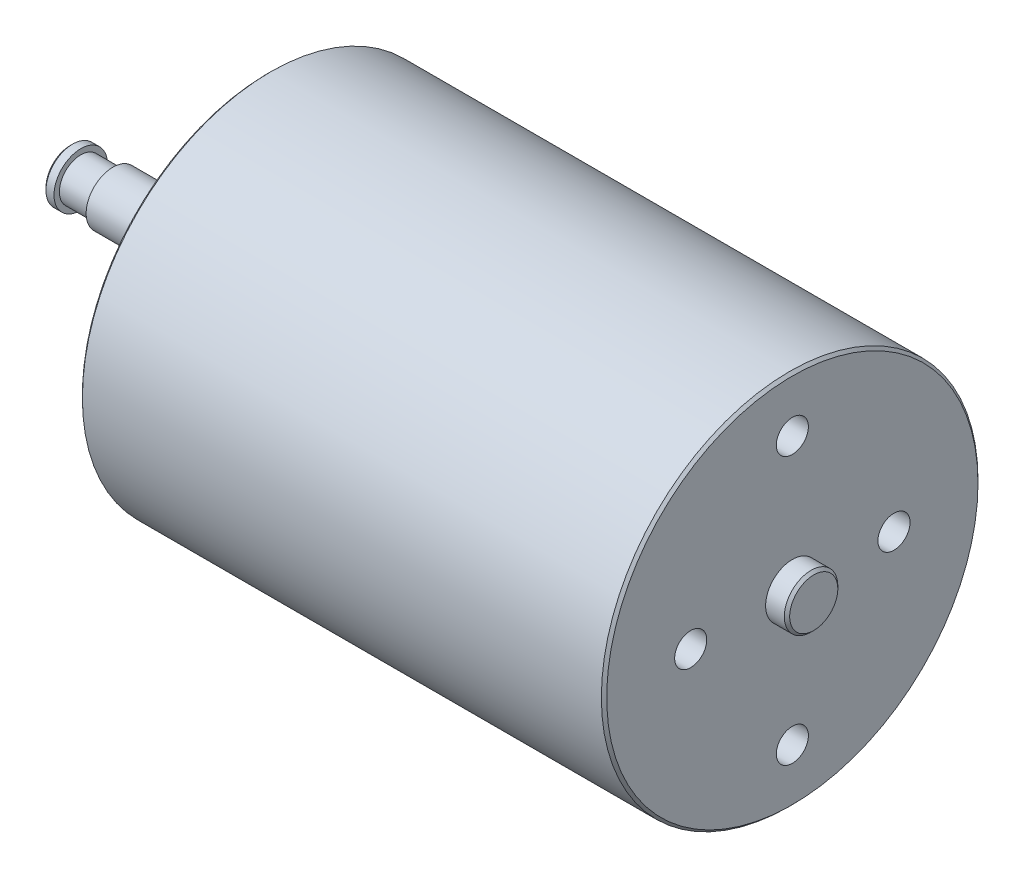
ISO-10303-21;
HEADER;
FILE_DESCRIPTION(('STEP AP214'),'2;1');
FILE_NAME('part.step','',(''),(''),'','','');
FILE_SCHEMA(('AUTOMOTIVE_DESIGN { 1 0 10303 214 1 1 1 1 }'));
ENDSEC;
DATA;
#1=APPLICATION_CONTEXT('core data for automotive mechanical design processes');
#2=APPLICATION_PROTOCOL_DEFINITION('international standard','automotive_design',2000,#1);
#3=PRODUCT_CONTEXT('',#1,'mechanical');
#4=PRODUCT('Part','Part','',(#3));
#5=PRODUCT_RELATED_PRODUCT_CATEGORY('part','',(#4));
#6=PRODUCT_DEFINITION_FORMATION('','',#4);
#7=PRODUCT_DEFINITION_CONTEXT('part definition',#1,'design');
#8=PRODUCT_DEFINITION('design','',#6,#7);
#9=PRODUCT_DEFINITION_SHAPE('','',#8);
#10=(LENGTH_UNIT() NAMED_UNIT(*) SI_UNIT(.MILLI.,.METRE.));
#11=(NAMED_UNIT(*) PLANE_ANGLE_UNIT() SI_UNIT($,.RADIAN.));
#12=(NAMED_UNIT(*) SI_UNIT($,.STERADIAN.) SOLID_ANGLE_UNIT());
#13=UNCERTAINTY_MEASURE_WITH_UNIT(LENGTH_MEASURE(1.E-05),#10,'distance_accuracy_value','');
#14=(GEOMETRIC_REPRESENTATION_CONTEXT(3) GLOBAL_UNCERTAINTY_ASSIGNED_CONTEXT((#13)) GLOBAL_UNIT_ASSIGNED_CONTEXT((#10,
#11,#12)) REPRESENTATION_CONTEXT('',''));
#15=CARTESIAN_POINT('',(0.,0.,0.));
#16=DIRECTION('',(0.,0.,1.));
#17=DIRECTION('',(1.,0.,0.));
#18=AXIS2_PLACEMENT_3D('',#15,#16,#17);
#19=CARTESIAN_POINT('',(49.,0.,0.));
#20=DIRECTION('',(-1.,0.,0.));
#21=DIRECTION('',(0.,0.,1.));
#22=AXIS2_PLACEMENT_3D('',#19,#20,#21);
#23=CYLINDRICAL_SURFACE('',#22,17.6);
#24=CARTESIAN_POINT('',(48.75,0.,0.));
#25=DIRECTION('',(1.,0.,0.));
#26=DIRECTION('',(0.,0.,-1.));
#27=AXIS2_PLACEMENT_3D('',#24,#25,#26);
#28=CIRCLE('',#27,17.6);
#29=CARTESIAN_POINT('',(48.75,0.,-17.6));
#30=VERTEX_POINT('',#29);
#31=EDGE_CURVE('E124',#30,#30,#28,.F.);
#32=ORIENTED_EDGE('',*,*,#31,.T.);
#33=EDGE_LOOP('',(#32));
#34=FACE_BOUND('',#33,.T.);
#35=CARTESIAN_POINT('',(0.250000000000007,0.,0.));
#36=DIRECTION('',(1.,0.,0.));
#37=DIRECTION('',(0.,0.,-1.));
#38=AXIS2_PLACEMENT_3D('',#35,#36,#37);
#39=CIRCLE('',#38,17.6);
#40=CARTESIAN_POINT('',(0.250000000000007,0.,-17.6));
#41=VERTEX_POINT('',#40);
#42=EDGE_CURVE('E128',#41,#41,#39,.T.);
#43=ORIENTED_EDGE('',*,*,#42,.T.);
#44=EDGE_LOOP('',(#43));
#45=FACE_BOUND('',#44,.T.);
#46=ADVANCED_FACE('F44',(#34,#45),#23,.T.);
#47=CARTESIAN_POINT('',(49.,0.,0.));
#48=DIRECTION('',(1.,0.,0.));
#49=DIRECTION('',(0.,0.,-1.));
#50=AXIS2_PLACEMENT_3D('',#47,#48,#49);
#51=PLANE('',#50);
#52=CARTESIAN_POINT('',(49.,0.,0.));
#53=DIRECTION('',(1.,0.,0.));
#54=DIRECTION('',(0.,0.,-1.));
#55=AXIS2_PLACEMENT_3D('',#52,#53,#54);
#56=CIRCLE('',#55,17.35);
#57=CARTESIAN_POINT('',(49.,0.,-17.35));
#58=VERTEX_POINT('',#57);
#59=EDGE_CURVE('E132',#58,#58,#56,.T.);
#60=ORIENTED_EDGE('',*,*,#59,.T.);
#61=EDGE_LOOP('',(#60));
#62=FACE_BOUND('',#61,.T.);
#63=CARTESIAN_POINT('',(49.,0.,0.));
#64=DIRECTION('',(1.,0.,0.));
#65=DIRECTION('',(0.,0.,-1.));
#66=AXIS2_PLACEMENT_3D('',#63,#64,#65);
#67=CIRCLE('',#66,2.5);
#68=CARTESIAN_POINT('',(49.,0.,-2.5));
#69=VERTEX_POINT('',#68);
#70=EDGE_CURVE('E173',#69,#69,#67,.T.);
#71=ORIENTED_EDGE('',*,*,#70,.F.);
#72=EDGE_LOOP('',(#71));
#73=FACE_BOUND('',#72,.T.);
#74=CARTESIAN_POINT('',(49.,12.5,0.));
#75=DIRECTION('',(1.,0.,0.));
#76=DIRECTION('',(0.,0.,-1.));
#77=AXIS2_PLACEMENT_3D('',#74,#75,#76);
#78=CIRCLE('',#77,1.49999999999999);
#79=CARTESIAN_POINT('',(49.,12.5,-1.49999999999999));
#80=VERTEX_POINT('',#79);
#81=EDGE_CURVE('E169',#80,#80,#78,.T.);
#82=ORIENTED_EDGE('',*,*,#81,.F.);
#83=EDGE_LOOP('',(#82));
#84=FACE_BOUND('',#83,.T.);
#85=CARTESIAN_POINT('',(49.,0.,-9.5));
#86=DIRECTION('',(1.,0.,0.));
#87=DIRECTION('',(0.,0.,-1.));
#88=AXIS2_PLACEMENT_3D('',#85,#86,#87);
#89=CIRCLE('',#88,1.49999999999999);
#90=CARTESIAN_POINT('',(49.,0.,-11.));
#91=VERTEX_POINT('',#90);
#92=EDGE_CURVE('E161',#91,#91,#89,.T.);
#93=ORIENTED_EDGE('',*,*,#92,.F.);
#94=EDGE_LOOP('',(#93));
#95=FACE_BOUND('',#94,.T.);
#96=CARTESIAN_POINT('',(49.,-12.5,0.));
#97=DIRECTION('',(1.,0.,0.));
#98=DIRECTION('',(0.,0.,-1.));
#99=AXIS2_PLACEMENT_3D('',#96,#97,#98);
#100=CIRCLE('',#99,1.49999999999999);
#101=CARTESIAN_POINT('',(49.,-12.5,-1.49999999999999));
#102=VERTEX_POINT('',#101);
#103=EDGE_CURVE('E153',#102,#102,#100,.T.);
#104=ORIENTED_EDGE('',*,*,#103,.F.);
#105=EDGE_LOOP('',(#104));
#106=FACE_BOUND('',#105,.T.);
#107=CARTESIAN_POINT('',(49.,0.,9.5));
#108=DIRECTION('',(1.,0.,0.));
#109=DIRECTION('',(0.,0.,-1.));
#110=AXIS2_PLACEMENT_3D('',#107,#108,#109);
#111=CIRCLE('',#110,1.49999999999999);
#112=CARTESIAN_POINT('',(49.,0.,8.00000000000001));
#113=VERTEX_POINT('',#112);
#114=EDGE_CURVE('E145',#113,#113,#111,.T.);
#115=ORIENTED_EDGE('',*,*,#114,.F.);
#116=EDGE_LOOP('',(#115));
#117=FACE_BOUND('',#116,.T.);
#118=ADVANCED_FACE('F206',(#62,#73,#84,#95,#106,#117),#51,.T.);
#119=CARTESIAN_POINT('',(0.,0.,0.));
#120=DIRECTION('',(1.,0.,0.));
#121=DIRECTION('',(0.,0.,-1.));
#122=AXIS2_PLACEMENT_3D('',#119,#120,#121);
#123=PLANE('',#122);
#124=CARTESIAN_POINT('',(0.,0.,0.));
#125=DIRECTION('',(1.,0.,0.));
#126=DIRECTION('',(0.,0.,-1.));
#127=AXIS2_PLACEMENT_3D('',#124,#125,#126);
#128=CIRCLE('',#127,17.35);
#129=CARTESIAN_POINT('',(0.,0.,-17.35));
#130=VERTEX_POINT('',#129);
#131=EDGE_CURVE('E120',#130,#130,#128,.F.);
#132=ORIENTED_EDGE('',*,*,#131,.T.);
#133=EDGE_LOOP('',(#132));
#134=FACE_BOUND('',#133,.T.);
#135=CARTESIAN_POINT('',(0.,0.,0.));
#136=DIRECTION('',(1.,0.,0.));
#137=DIRECTION('',(0.,0.,-1.));
#138=AXIS2_PLACEMENT_3D('',#135,#136,#137);
#139=CIRCLE('',#138,2.5);
#140=CARTESIAN_POINT('',(0.,0.,-2.5));
#141=VERTEX_POINT('',#140);
#142=EDGE_CURVE('E137',#141,#141,#139,.F.);
#143=ORIENTED_EDGE('',*,*,#142,.F.);
#144=EDGE_LOOP('',(#143));
#145=FACE_BOUND('',#144,.T.);
#146=ADVANCED_FACE('F212',(#134,#145),#123,.F.);
#147=CARTESIAN_POINT('',(44.,0.,9.5));
#148=DIRECTION('',(1.,0.,0.));
#149=DIRECTION('',(0.,0.,-1.));
#150=AXIS2_PLACEMENT_3D('',#147,#148,#149);
#151=CONICAL_SURFACE('',#150,1.49999999999999,1.02974425867665);
#152=CARTESIAN_POINT('',(43.0987090714587,0.,9.5));
#153=VERTEX_POINT('',#152);
#154=VERTEX_LOOP('',#153);
#155=FACE_BOUND('',#154,.T.);
#156=CARTESIAN_POINT('',(44.,0.,9.5));
#157=DIRECTION('',(1.,0.,0.));
#158=DIRECTION('',(0.,0.,-1.));
#159=AXIS2_PLACEMENT_3D('',#156,#157,#158);
#160=CIRCLE('',#159,1.49999999999999);
#161=CARTESIAN_POINT('',(44.,0.,8.00000000000001));
#162=VERTEX_POINT('',#161);
#163=EDGE_CURVE('E141',#162,#162,#160,.T.);
#164=ORIENTED_EDGE('',*,*,#163,.T.);
#165=EDGE_LOOP('',(#164));
#166=FACE_BOUND('',#165,.T.);
#167=ADVANCED_FACE('F300',(#155,#166),#151,.F.);
#168=CARTESIAN_POINT('',(49.,0.,9.5));
#169=DIRECTION('',(1.,0.,0.));
#170=DIRECTION('',(0.,0.,-1.));
#171=AXIS2_PLACEMENT_3D('',#168,#169,#170);
#172=CYLINDRICAL_SURFACE('',#171,1.49999999999999);
#173=ORIENTED_EDGE('',*,*,#163,.F.);
#174=EDGE_LOOP('',(#173));
#175=FACE_BOUND('',#174,.T.);
#176=ORIENTED_EDGE('',*,*,#114,.T.);
#177=EDGE_LOOP('',(#176));
#178=FACE_BOUND('',#177,.T.);
#179=ADVANCED_FACE('F296',(#175,#178),#172,.F.);
#180=CARTESIAN_POINT('',(44.,-12.5,0.));
#181=DIRECTION('',(1.,0.,0.));
#182=DIRECTION('',(0.,0.,-1.));
#183=AXIS2_PLACEMENT_3D('',#180,#181,#182);
#184=CONICAL_SURFACE('',#183,1.49999999999999,1.02974425867665);
#185=CARTESIAN_POINT('',(43.0987090714587,-12.5,0.));
#186=VERTEX_POINT('',#185);
#187=VERTEX_LOOP('',#186);
#188=FACE_BOUND('',#187,.T.);
#189=CARTESIAN_POINT('',(44.,-12.5,0.));
#190=DIRECTION('',(1.,0.,0.));
#191=DIRECTION('',(0.,0.,-1.));
#192=AXIS2_PLACEMENT_3D('',#189,#190,#191);
#193=CIRCLE('',#192,1.49999999999999);
#194=CARTESIAN_POINT('',(44.,-12.5,-1.5));
#195=VERTEX_POINT('',#194);
#196=EDGE_CURVE('E149',#195,#195,#193,.T.);
#197=ORIENTED_EDGE('',*,*,#196,.T.);
#198=EDGE_LOOP('',(#197));
#199=FACE_BOUND('',#198,.T.);
#200=ADVANCED_FACE('F292',(#188,#199),#184,.F.);
#201=CARTESIAN_POINT('',(49.,-12.5,0.));
#202=DIRECTION('',(1.,0.,0.));
#203=DIRECTION('',(0.,0.,-1.));
#204=AXIS2_PLACEMENT_3D('',#201,#202,#203);
#205=CYLINDRICAL_SURFACE('',#204,1.49999999999999);
#206=ORIENTED_EDGE('',*,*,#196,.F.);
#207=EDGE_LOOP('',(#206));
#208=FACE_BOUND('',#207,.T.);
#209=ORIENTED_EDGE('',*,*,#103,.T.);
#210=EDGE_LOOP('',(#209));
#211=FACE_BOUND('',#210,.T.);
#212=ADVANCED_FACE('F288',(#208,#211),#205,.F.);
#213=CARTESIAN_POINT('',(44.,0.,-9.5));
#214=DIRECTION('',(1.,0.,0.));
#215=DIRECTION('',(0.,0.,-1.));
#216=AXIS2_PLACEMENT_3D('',#213,#214,#215);
#217=CONICAL_SURFACE('',#216,1.49999999999999,1.02974425867665);
#218=CARTESIAN_POINT('',(43.0987090714587,0.,-9.5));
#219=VERTEX_POINT('',#218);
#220=VERTEX_LOOP('',#219);
#221=FACE_BOUND('',#220,.T.);
#222=CARTESIAN_POINT('',(44.,0.,-9.5));
#223=DIRECTION('',(1.,0.,0.));
#224=DIRECTION('',(0.,0.,-1.));
#225=AXIS2_PLACEMENT_3D('',#222,#223,#224);
#226=CIRCLE('',#225,1.49999999999999);
#227=CARTESIAN_POINT('',(44.,0.,-11.));
#228=VERTEX_POINT('',#227);
#229=EDGE_CURVE('E157',#228,#228,#226,.T.);
#230=ORIENTED_EDGE('',*,*,#229,.T.);
#231=EDGE_LOOP('',(#230));
#232=FACE_BOUND('',#231,.T.);
#233=ADVANCED_FACE('F284',(#221,#232),#217,.F.);
#234=CARTESIAN_POINT('',(49.,0.,-9.5));
#235=DIRECTION('',(1.,0.,0.));
#236=DIRECTION('',(0.,0.,-1.));
#237=AXIS2_PLACEMENT_3D('',#234,#235,#236);
#238=CYLINDRICAL_SURFACE('',#237,1.49999999999999);
#239=ORIENTED_EDGE('',*,*,#229,.F.);
#240=EDGE_LOOP('',(#239));
#241=FACE_BOUND('',#240,.T.);
#242=ORIENTED_EDGE('',*,*,#92,.T.);
#243=EDGE_LOOP('',(#242));
#244=FACE_BOUND('',#243,.T.);
#245=ADVANCED_FACE('F280',(#241,#244),#238,.F.);
#246=CARTESIAN_POINT('',(44.,12.5,0.));
#247=DIRECTION('',(1.,0.,0.));
#248=DIRECTION('',(0.,0.,-1.));
#249=AXIS2_PLACEMENT_3D('',#246,#247,#248);
#250=CONICAL_SURFACE('',#249,1.49999999999999,1.02974425867665);
#251=CARTESIAN_POINT('',(43.0987090714587,12.5,0.));
#252=VERTEX_POINT('',#251);
#253=VERTEX_LOOP('',#252);
#254=FACE_BOUND('',#253,.T.);
#255=CARTESIAN_POINT('',(44.,12.5,0.));
#256=DIRECTION('',(1.,0.,0.));
#257=DIRECTION('',(0.,0.,-1.));
#258=AXIS2_PLACEMENT_3D('',#255,#256,#257);
#259=CIRCLE('',#258,1.49999999999999);
#260=CARTESIAN_POINT('',(44.,12.5,-1.49999999999999));
#261=VERTEX_POINT('',#260);
#262=EDGE_CURVE('E165',#261,#261,#259,.T.);
#263=ORIENTED_EDGE('',*,*,#262,.T.);
#264=EDGE_LOOP('',(#263));
#265=FACE_BOUND('',#264,.T.);
#266=ADVANCED_FACE('F276',(#254,#265),#250,.F.);
#267=CARTESIAN_POINT('',(49.,12.5,0.));
#268=DIRECTION('',(1.,0.,0.));
#269=DIRECTION('',(0.,0.,-1.));
#270=AXIS2_PLACEMENT_3D('',#267,#268,#269);
#271=CYLINDRICAL_SURFACE('',#270,1.49999999999999);
#272=ORIENTED_EDGE('',*,*,#262,.F.);
#273=EDGE_LOOP('',(#272));
#274=FACE_BOUND('',#273,.T.);
#275=ORIENTED_EDGE('',*,*,#81,.T.);
#276=EDGE_LOOP('',(#275));
#277=FACE_BOUND('',#276,.T.);
#278=ADVANCED_FACE('F272',(#274,#277),#271,.F.);
#279=CARTESIAN_POINT('',(51.,0.,0.));
#280=DIRECTION('',(-1.,0.,0.));
#281=DIRECTION('',(0.,0.,1.));
#282=AXIS2_PLACEMENT_3D('',#279,#280,#281);
#283=CYLINDRICAL_SURFACE('',#282,2.5);
#284=CARTESIAN_POINT('',(50.75,0.,0.));
#285=DIRECTION('',(1.,0.,0.));
#286=DIRECTION('',(0.,0.,-1.));
#287=AXIS2_PLACEMENT_3D('',#284,#285,#286);
#288=CIRCLE('',#287,2.5);
#289=CARTESIAN_POINT('',(50.75,0.,-2.5));
#290=VERTEX_POINT('',#289);
#291=EDGE_CURVE('E88',#290,#290,#288,.F.);
#292=ORIENTED_EDGE('',*,*,#291,.T.);
#293=EDGE_LOOP('',(#292));
#294=FACE_BOUND('',#293,.T.);
#295=ORIENTED_EDGE('',*,*,#70,.T.);
#296=EDGE_LOOP('',(#295));
#297=FACE_BOUND('',#296,.T.);
#298=ADVANCED_FACE('F268',(#294,#297),#283,.T.);
#299=CARTESIAN_POINT('',(51.,0.,0.));
#300=DIRECTION('',(1.,0.,0.));
#301=DIRECTION('',(0.,0.,-1.));
#302=AXIS2_PLACEMENT_3D('',#299,#300,#301);
#303=PLANE('',#302);
#304=CARTESIAN_POINT('',(51.,0.,0.));
#305=DIRECTION('',(1.,0.,0.));
#306=DIRECTION('',(0.,0.,-1.));
#307=AXIS2_PLACEMENT_3D('',#304,#305,#306);
#308=CIRCLE('',#307,2.24999999999998);
#309=CARTESIAN_POINT('',(51.,0.,-2.24999999999998));
#310=VERTEX_POINT('',#309);
#311=EDGE_CURVE('E108',#310,#310,#308,.T.);
#312=ORIENTED_EDGE('',*,*,#311,.T.);
#313=EDGE_LOOP('',(#312));
#314=FACE_BOUND('',#313,.T.);
#315=ADVANCED_FACE('F265',(#314),#303,.T.);
#316=CARTESIAN_POINT('',(-14.5,0.,0.));
#317=DIRECTION('',(1.,0.,0.));
#318=DIRECTION('',(0.,0.,-1.));
#319=AXIS2_PLACEMENT_3D('',#316,#317,#318);
#320=CYLINDRICAL_SURFACE('',#319,2.5);
#321=DIRECTION('',(1.,0.,0.));
#322=VECTOR('',#321,1.);
#323=CARTESIAN_POINT('',(-14.5,-2.,1.5));
#324=LINE('',#323,#322);
#325=CARTESIAN_POINT('',(-10.,-2.,1.5));
#326=VERTEX_POINT('',#325);
#327=CARTESIAN_POINT('',(-2.,-2.,1.5));
#328=VERTEX_POINT('',#327);
#329=EDGE_CURVE('E12',#326,#328,#324,.T.);
#330=ORIENTED_EDGE('',*,*,#329,.T.);
#331=CARTESIAN_POINT('',(-2.,0.,0.));
#332=DIRECTION('',(1.,0.,0.));
#333=DIRECTION('',(0.,0.,-1.));
#334=AXIS2_PLACEMENT_3D('',#331,#332,#333);
#335=CIRCLE('',#334,2.5);
#336=CARTESIAN_POINT('',(-2.,-2.,-1.5));
#337=VERTEX_POINT('',#336);
#338=EDGE_CURVE('E82',#328,#337,#335,.T.);
#339=ORIENTED_EDGE('',*,*,#338,.T.);
#340=DIRECTION('',(1.,0.,0.));
#341=VECTOR('',#340,1.);
#342=CARTESIAN_POINT('',(-14.5,-2.,-1.5));
#343=LINE('',#342,#341);
#344=CARTESIAN_POINT('',(-10.,-2.,-1.5));
#345=VERTEX_POINT('',#344);
#346=EDGE_CURVE('E87',#337,#345,#343,.F.);
#347=ORIENTED_EDGE('',*,*,#346,.T.);
#348=CARTESIAN_POINT('',(-10.,0.,0.));
#349=DIRECTION('',(-1.,0.,0.));
#350=DIRECTION('',(0.,0.,1.));
#351=AXIS2_PLACEMENT_3D('',#348,#349,#350);
#352=CIRCLE('',#351,2.5);
#353=EDGE_CURVE('E54',#345,#326,#352,.T.);
#354=ORIENTED_EDGE('',*,*,#353,.T.);
#355=EDGE_LOOP('',(#330,#339,#347,#354));
#356=FACE_BOUND('',#355,.T.);
#357=CARTESIAN_POINT('',(-14.5,0.,0.));
#358=DIRECTION('',(-1.,0.,0.));
#359=DIRECTION('',(0.,0.,1.));
#360=AXIS2_PLACEMENT_3D('',#357,#358,#359);
#361=CIRCLE('',#360,2.5);
#362=CARTESIAN_POINT('',(-14.5,0.,2.5));
#363=VERTEX_POINT('',#362);
#364=EDGE_CURVE('E177',#363,#363,#361,.T.);
#365=ORIENTED_EDGE('',*,*,#364,.F.);
#366=EDGE_LOOP('',(#365));
#367=FACE_BOUND('',#366,.T.);
#368=ORIENTED_EDGE('',*,*,#142,.T.);
#369=EDGE_LOOP('',(#368));
#370=FACE_BOUND('',#369,.T.);
#371=ADVANCED_FACE('F98',(#356,#367,#370),#320,.T.);
#372=CARTESIAN_POINT('',(-14.5,0.,0.));
#373=DIRECTION('',(-1.,0.,0.));
#374=DIRECTION('',(0.,0.,1.));
#375=AXIS2_PLACEMENT_3D('',#372,#373,#374);
#376=PLANE('',#375);
#377=CARTESIAN_POINT('',(-14.5,0.,0.));
#378=DIRECTION('',(-1.,0.,0.));
#379=DIRECTION('',(0.,0.,1.));
#380=AXIS2_PLACEMENT_3D('',#377,#378,#379);
#381=CIRCLE('',#380,2.);
#382=CARTESIAN_POINT('',(-14.5,0.,2.));
#383=VERTEX_POINT('',#382);
#384=EDGE_CURVE('E136',#383,#383,#381,.T.);
#385=ORIENTED_EDGE('',*,*,#384,.F.);
#386=EDGE_LOOP('',(#385));
#387=FACE_BOUND('',#386,.T.);
#388=ORIENTED_EDGE('',*,*,#364,.T.);
#389=EDGE_LOOP('',(#388));
#390=FACE_BOUND('',#389,.T.);
#391=ADVANCED_FACE('F258',(#387,#390),#376,.T.);
#392=CARTESIAN_POINT('',(-17.5,0.,0.));
#393=DIRECTION('',(1.,0.,0.));
#394=DIRECTION('',(0.,0.,-1.));
#395=AXIS2_PLACEMENT_3D('',#392,#393,#394);
#396=CYLINDRICAL_SURFACE('',#395,2.);
#397=CARTESIAN_POINT('',(-17.5,0.,0.));
#398=DIRECTION('',(-1.,0.,0.));
#399=DIRECTION('',(0.,0.,1.));
#400=AXIS2_PLACEMENT_3D('',#397,#398,#399);
#401=CIRCLE('',#400,2.);
#402=CARTESIAN_POINT('',(-17.5,0.,2.));
#403=VERTEX_POINT('',#402);
#404=EDGE_CURVE('E181',#403,#403,#401,.T.);
#405=ORIENTED_EDGE('',*,*,#404,.F.);
#406=EDGE_LOOP('',(#405));
#407=FACE_BOUND('',#406,.T.);
#408=ORIENTED_EDGE('',*,*,#384,.T.);
#409=EDGE_LOOP('',(#408));
#410=FACE_BOUND('',#409,.T.);
#411=ADVANCED_FACE('F252',(#407,#410),#396,.T.);
#412=CARTESIAN_POINT('',(-18.5,0.,0.));
#413=DIRECTION('',(1.,0.,0.));
#414=DIRECTION('',(0.,0.,-1.));
#415=AXIS2_PLACEMENT_3D('',#412,#413,#414);
#416=CYLINDRICAL_SURFACE('',#415,2.5);
#417=CARTESIAN_POINT('',(-18.25,0.,0.));
#418=DIRECTION('',(-1.,0.,0.));
#419=DIRECTION('',(0.,0.,1.));
#420=AXIS2_PLACEMENT_3D('',#417,#418,#419);
#421=CIRCLE('',#420,2.5);
#422=CARTESIAN_POINT('',(-18.25,0.,2.5));
#423=VERTEX_POINT('',#422);
#424=EDGE_CURVE('E112',#423,#423,#421,.F.);
#425=ORIENTED_EDGE('',*,*,#424,.T.);
#426=EDGE_LOOP('',(#425));
#427=FACE_BOUND('',#426,.T.);
#428=CARTESIAN_POINT('',(-17.5,0.,0.));
#429=DIRECTION('',(-1.,0.,0.));
#430=DIRECTION('',(0.,0.,1.));
#431=AXIS2_PLACEMENT_3D('',#428,#429,#430);
#432=CIRCLE('',#431,2.5);
#433=CARTESIAN_POINT('',(-17.5,0.,2.5));
#434=VERTEX_POINT('',#433);
#435=EDGE_CURVE('E188',#434,#434,#432,.T.);
#436=ORIENTED_EDGE('',*,*,#435,.T.);
#437=EDGE_LOOP('',(#436));
#438=FACE_BOUND('',#437,.T.);
#439=ADVANCED_FACE('F245',(#427,#438),#416,.T.);
#440=CARTESIAN_POINT('',(-18.5,0.,0.));
#441=DIRECTION('',(-1.,0.,0.));
#442=DIRECTION('',(0.,0.,1.));
#443=AXIS2_PLACEMENT_3D('',#440,#441,#442);
#444=PLANE('',#443);
#445=CARTESIAN_POINT('',(-18.5,0.,0.));
#446=DIRECTION('',(-1.,0.,0.));
#447=DIRECTION('',(0.,0.,1.));
#448=AXIS2_PLACEMENT_3D('',#445,#446,#447);
#449=CIRCLE('',#448,2.24999999999998);
#450=CARTESIAN_POINT('',(-18.5,0.,2.24999999999998));
#451=VERTEX_POINT('',#450);
#452=EDGE_CURVE('E116',#451,#451,#449,.T.);
#453=ORIENTED_EDGE('',*,*,#452,.T.);
#454=EDGE_LOOP('',(#453));
#455=FACE_BOUND('',#454,.T.);
#456=ADVANCED_FACE('F243',(#455),#444,.T.);
#457=CARTESIAN_POINT('',(-17.5,0.,0.));
#458=DIRECTION('',(-1.,0.,0.));
#459=DIRECTION('',(0.,0.,1.));
#460=AXIS2_PLACEMENT_3D('',#457,#458,#459);
#461=PLANE('',#460);
#462=ORIENTED_EDGE('',*,*,#404,.T.);
#463=EDGE_LOOP('',(#462));
#464=FACE_BOUND('',#463,.T.);
#465=ORIENTED_EDGE('',*,*,#435,.F.);
#466=EDGE_LOOP('',(#465));
#467=FACE_BOUND('',#466,.T.);
#468=ADVANCED_FACE('F226',(#464,#467),#461,.F.);
#469=CARTESIAN_POINT('',(49.,0.,0.));
#470=DIRECTION('',(-1.,0.,0.));
#471=DIRECTION('',(0.,0.,1.));
#472=AXIS2_PLACEMENT_3D('',#469,#470,#471);
#473=CONICAL_SURFACE('',#472,17.35,0.785398163397414);
#474=ORIENTED_EDGE('',*,*,#31,.F.);
#475=EDGE_LOOP('',(#474));
#476=FACE_BOUND('',#475,.T.);
#477=ORIENTED_EDGE('',*,*,#59,.F.);
#478=EDGE_LOOP('',(#477));
#479=FACE_BOUND('',#478,.T.);
#480=ADVANCED_FACE('F219',(#476,#479),#473,.T.);
#481=CARTESIAN_POINT('',(0.250000000000007,0.,0.));
#482=DIRECTION('',(1.,0.,0.));
#483=DIRECTION('',(0.,0.,-1.));
#484=AXIS2_PLACEMENT_3D('',#481,#482,#483);
#485=CONICAL_SURFACE('',#484,17.6,0.785398163397455);
#486=ORIENTED_EDGE('',*,*,#131,.F.);
#487=EDGE_LOOP('',(#486));
#488=FACE_BOUND('',#487,.T.);
#489=ORIENTED_EDGE('',*,*,#42,.F.);
#490=EDGE_LOOP('',(#489));
#491=FACE_BOUND('',#490,.T.);
#492=ADVANCED_FACE('F225',(#488,#491),#485,.T.);
#493=CARTESIAN_POINT('',(-18.5,0.,0.));
#494=DIRECTION('',(1.,0.,0.));
#495=DIRECTION('',(0.,0.,-1.));
#496=AXIS2_PLACEMENT_3D('',#493,#494,#495);
#497=CONICAL_SURFACE('',#496,2.24999999999998,0.785398163397458);
#498=ORIENTED_EDGE('',*,*,#424,.F.);
#499=EDGE_LOOP('',(#498));
#500=FACE_BOUND('',#499,.T.);
#501=ORIENTED_EDGE('',*,*,#452,.F.);
#502=EDGE_LOOP('',(#501));
#503=FACE_BOUND('',#502,.T.);
#504=ADVANCED_FACE('F201',(#500,#503),#497,.T.);
#505=CARTESIAN_POINT('',(51.,0.,0.));
#506=DIRECTION('',(-1.,0.,0.));
#507=DIRECTION('',(0.,0.,1.));
#508=AXIS2_PLACEMENT_3D('',#505,#506,#507);
#509=CONICAL_SURFACE('',#508,2.24999999999998,0.785398163397458);
#510=ORIENTED_EDGE('',*,*,#291,.F.);
#511=EDGE_LOOP('',(#510));
#512=FACE_BOUND('',#511,.T.);
#513=ORIENTED_EDGE('',*,*,#311,.F.);
#514=EDGE_LOOP('',(#513));
#515=FACE_BOUND('',#514,.T.);
#516=ADVANCED_FACE('F47',(#512,#515),#509,.T.);
#517=CARTESIAN_POINT('',(-10.,-2.5,-17.6));
#518=DIRECTION('',(-1.,0.,0.));
#519=DIRECTION('',(0.,0.,1.));
#520=AXIS2_PLACEMENT_3D('',#517,#518,#519);
#521=PLANE('',#520);
#522=DIRECTION('',(0.,0.,1.));
#523=VECTOR('',#522,1.);
#524=CARTESIAN_POINT('',(-10.,-2.,-17.6));
#525=LINE('',#524,#523);
#526=EDGE_CURVE('E95',#345,#326,#525,.T.);
#527=ORIENTED_EDGE('',*,*,#526,.T.);
#528=ORIENTED_EDGE('',*,*,#353,.F.);
#529=EDGE_LOOP('',(#527,#528));
#530=FACE_BOUND('',#529,.T.);
#531=ADVANCED_FACE('F193',(#530),#521,.F.);
#532=CARTESIAN_POINT('',(-10.,-2.,-17.6));
#533=DIRECTION('',(0.,1.,0.));
#534=DIRECTION('',(0.,0.,1.));
#535=AXIS2_PLACEMENT_3D('',#532,#533,#534);
#536=PLANE('',#535);
#537=ORIENTED_EDGE('',*,*,#526,.F.);
#538=ORIENTED_EDGE('',*,*,#346,.F.);
#539=DIRECTION('',(0.,0.,1.));
#540=VECTOR('',#539,1.);
#541=CARTESIAN_POINT('',(-2.,-2.,-17.6));
#542=LINE('',#541,#540);
#543=EDGE_CURVE('E60',#337,#328,#542,.T.);
#544=ORIENTED_EDGE('',*,*,#543,.T.);
#545=ORIENTED_EDGE('',*,*,#329,.F.);
#546=EDGE_LOOP('',(#537,#538,#544,#545));
#547=FACE_BOUND('',#546,.T.);
#548=ADVANCED_FACE('F92',(#547),#536,.F.);
#549=CARTESIAN_POINT('',(-2.,-2.5,-17.6));
#550=DIRECTION('',(1.,0.,0.));
#551=DIRECTION('',(0.,0.,-1.));
#552=AXIS2_PLACEMENT_3D('',#549,#550,#551);
#553=PLANE('',#552);
#554=ORIENTED_EDGE('',*,*,#543,.F.);
#555=ORIENTED_EDGE('',*,*,#338,.F.);
#556=EDGE_LOOP('',(#554,#555));
#557=FACE_BOUND('',#556,.T.);
#558=ADVANCED_FACE('F83',(#557),#553,.F.);
#559=CLOSED_SHELL('',(#46,#118,#146,#167,#179,#200,#212,#233,#245,#266,#278,#298,#315,#371,#391,
#411,#439,#456,#468,#480,#492,#504,#516,#531,#548,#558));
#560=MANIFOLD_SOLID_BREP('B2',#559);
#561=ADVANCED_BREP_SHAPE_REPRESENTATION('',(#18,#560),#14);
#562=SHAPE_DEFINITION_REPRESENTATION(#9,#561);
ENDSEC;
END-ISO-10303-21;
